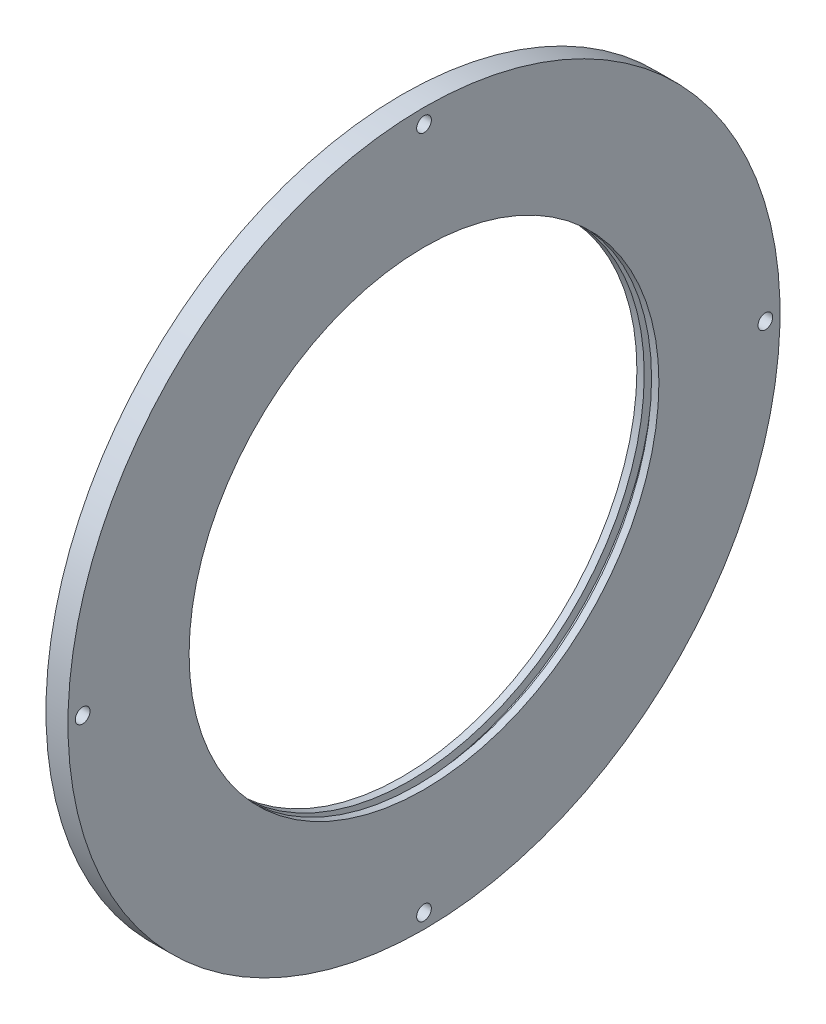
ISO-10303-21;
HEADER;
FILE_DESCRIPTION(('STEP AP214'),'2;1');
FILE_NAME('part.step','',(''),(''),'','','');
FILE_SCHEMA(('AUTOMOTIVE_DESIGN { 1 0 10303 214 1 1 1 1 }'));
ENDSEC;
DATA;
#1=APPLICATION_CONTEXT('core data for automotive mechanical design processes');
#2=APPLICATION_PROTOCOL_DEFINITION('international standard','automotive_design',2000,#1);
#3=PRODUCT_CONTEXT('',#1,'mechanical');
#4=PRODUCT('Part','Part','',(#3));
#5=PRODUCT_RELATED_PRODUCT_CATEGORY('part','',(#4));
#6=PRODUCT_DEFINITION_FORMATION('','',#4);
#7=PRODUCT_DEFINITION_CONTEXT('part definition',#1,'design');
#8=PRODUCT_DEFINITION('design','',#6,#7);
#9=PRODUCT_DEFINITION_SHAPE('','',#8);
#10=(LENGTH_UNIT() NAMED_UNIT(*) SI_UNIT(.MILLI.,.METRE.));
#11=(NAMED_UNIT(*) PLANE_ANGLE_UNIT() SI_UNIT($,.RADIAN.));
#12=(NAMED_UNIT(*) SI_UNIT($,.STERADIAN.) SOLID_ANGLE_UNIT());
#13=UNCERTAINTY_MEASURE_WITH_UNIT(LENGTH_MEASURE(1.E-05),#10,'distance_accuracy_value','');
#14=(GEOMETRIC_REPRESENTATION_CONTEXT(3) GLOBAL_UNCERTAINTY_ASSIGNED_CONTEXT((#13)) GLOBAL_UNIT_ASSIGNED_CONTEXT((#10,
#11,#12)) REPRESENTATION_CONTEXT('',''));
#15=CARTESIAN_POINT('',(0.,0.,0.));
#16=DIRECTION('',(0.,0.,1.));
#17=DIRECTION('',(1.,0.,0.));
#18=AXIS2_PLACEMENT_3D('',#15,#16,#17);
#19=CARTESIAN_POINT('',(3.,0.,0.));
#20=DIRECTION('',(1.,0.,0.));
#21=DIRECTION('',(0.,1.,0.));
#22=AXIS2_PLACEMENT_3D('',#19,#20,#21);
#23=CYLINDRICAL_SURFACE('',#22,97.);
#24=CARTESIAN_POINT('',(6.,0.,0.));
#25=DIRECTION('',(1.,0.,0.));
#26=DIRECTION('',(0.,0.,-1.));
#27=AXIS2_PLACEMENT_3D('',#24,#25,#26);
#28=CIRCLE('',#27,97.);
#29=CARTESIAN_POINT('',(6.,-97.,0.));
#30=VERTEX_POINT('',#29);
#31=EDGE_CURVE('E117',#30,#30,#28,.T.);
#32=ORIENTED_EDGE('',*,*,#31,.F.);
#33=DIRECTION('',(-1.,0.,0.));
#34=VECTOR('',#33,1.);
#35=CARTESIAN_POINT('',(3.,-97.,0.));
#36=LINE('',#35,#34);
#37=CARTESIAN_POINT('',(0.,-97.,0.));
#38=VERTEX_POINT('',#37);
#39=EDGE_CURVE('E11',#30,#38,#36,.T.);
#40=ORIENTED_EDGE('',*,*,#39,.T.);
#41=CARTESIAN_POINT('',(0.,0.,0.));
#42=DIRECTION('',(1.,0.,0.));
#43=DIRECTION('',(0.,0.,-1.));
#44=AXIS2_PLACEMENT_3D('',#41,#42,#43);
#45=CIRCLE('',#44,97.);
#46=EDGE_CURVE('E28',#38,#38,#45,.T.);
#47=ORIENTED_EDGE('',*,*,#46,.T.);
#48=ORIENTED_EDGE('',*,*,#39,.F.);
#49=EDGE_LOOP('',(#32,#40,#47,#48));
#50=FACE_BOUND('',#49,.T.);
#51=ADVANCED_FACE('F17',(#50),#23,.T.);
#52=CARTESIAN_POINT('',(0.,97.,0.));
#53=DIRECTION('',(-1.,0.,0.));
#54=DIRECTION('',(0.,0.,1.));
#55=AXIS2_PLACEMENT_3D('',#52,#53,#54);
#56=PLANE('',#55);
#57=CARTESIAN_POINT('',(0.,0.,0.));
#58=DIRECTION('',(1.,0.,0.));
#59=DIRECTION('',(0.,0.,-1.));
#60=AXIS2_PLACEMENT_3D('',#57,#58,#59);
#61=CIRCLE('',#60,64.);
#62=CARTESIAN_POINT('',(0.,-64.,0.));
#63=VERTEX_POINT('',#62);
#64=EDGE_CURVE('E110',#63,#63,#61,.T.);
#65=ORIENTED_EDGE('',*,*,#64,.T.);
#66=EDGE_LOOP('',(#65));
#67=FACE_BOUND('',#66,.T.);
#68=CARTESIAN_POINT('',(0.,0.,93.));
#69=DIRECTION('',(1.,0.,0.));
#70=DIRECTION('',(0.,0.,-1.));
#71=AXIS2_PLACEMENT_3D('',#68,#69,#70);
#72=CIRCLE('',#71,2.);
#73=CARTESIAN_POINT('',(0.,0.,95.));
#74=VERTEX_POINT('',#73);
#75=EDGE_CURVE('E121',#74,#74,#72,.T.);
#76=ORIENTED_EDGE('',*,*,#75,.T.);
#77=EDGE_LOOP('',(#76));
#78=FACE_BOUND('',#77,.T.);
#79=CARTESIAN_POINT('',(0.,-93.,0.));
#80=DIRECTION('',(1.,0.,0.));
#81=DIRECTION('',(0.,0.,-1.));
#82=AXIS2_PLACEMENT_3D('',#79,#80,#81);
#83=CIRCLE('',#82,2.);
#84=CARTESIAN_POINT('',(0.,-93.,2.));
#85=VERTEX_POINT('',#84);
#86=EDGE_CURVE('E116',#85,#85,#83,.T.);
#87=ORIENTED_EDGE('',*,*,#86,.T.);
#88=EDGE_LOOP('',(#87));
#89=FACE_BOUND('',#88,.T.);
#90=CARTESIAN_POINT('',(0.,93.,0.));
#91=DIRECTION('',(1.,0.,0.));
#92=DIRECTION('',(0.,0.,-1.));
#93=AXIS2_PLACEMENT_3D('',#90,#91,#92);
#94=CIRCLE('',#93,2.);
#95=CARTESIAN_POINT('',(0.,93.,2.));
#96=VERTEX_POINT('',#95);
#97=EDGE_CURVE('E140',#96,#96,#94,.T.);
#98=ORIENTED_EDGE('',*,*,#97,.T.);
#99=EDGE_LOOP('',(#98));
#100=FACE_BOUND('',#99,.T.);
#101=CARTESIAN_POINT('',(0.,0.,-93.));
#102=DIRECTION('',(1.,0.,0.));
#103=DIRECTION('',(0.,0.,-1.));
#104=AXIS2_PLACEMENT_3D('',#101,#102,#103);
#105=CIRCLE('',#104,2.);
#106=CARTESIAN_POINT('',(0.,0.,-91.));
#107=VERTEX_POINT('',#106);
#108=EDGE_CURVE('E131',#107,#107,#105,.T.);
#109=ORIENTED_EDGE('',*,*,#108,.T.);
#110=EDGE_LOOP('',(#109));
#111=FACE_BOUND('',#110,.T.);
#112=ORIENTED_EDGE('',*,*,#46,.F.);
#113=EDGE_LOOP('',(#112));
#114=FACE_BOUND('',#113,.T.);
#115=ADVANCED_FACE('F186',(#67,#78,#89,#100,#111,#114),#56,.T.);
#116=CARTESIAN_POINT('',(1.,0.,0.));
#117=DIRECTION('',(1.,0.,0.));
#118=DIRECTION('',(0.,1.,0.));
#119=AXIS2_PLACEMENT_3D('',#116,#117,#118);
#120=CYLINDRICAL_SURFACE('',#119,64.);
#121=CARTESIAN_POINT('',(2.,0.,0.));
#122=DIRECTION('',(1.,0.,0.));
#123=DIRECTION('',(0.,0.,-1.));
#124=AXIS2_PLACEMENT_3D('',#121,#122,#123);
#125=CIRCLE('',#124,64.);
#126=CARTESIAN_POINT('',(2.,-64.,0.));
#127=VERTEX_POINT('',#126);
#128=EDGE_CURVE('E126',#127,#127,#125,.T.);
#129=ORIENTED_EDGE('',*,*,#128,.T.);
#130=DIRECTION('',(-1.,0.,0.));
#131=VECTOR('',#130,1.);
#132=CARTESIAN_POINT('',(1.,-64.,0.));
#133=LINE('',#132,#131);
#134=EDGE_CURVE('E127',#127,#63,#133,.T.);
#135=ORIENTED_EDGE('',*,*,#134,.T.);
#136=ORIENTED_EDGE('',*,*,#64,.F.);
#137=ORIENTED_EDGE('',*,*,#134,.F.);
#138=EDGE_LOOP('',(#129,#135,#136,#137));
#139=FACE_BOUND('',#138,.T.);
#140=ADVANCED_FACE('F212',(#139),#120,.F.);
#141=CARTESIAN_POINT('',(2.,64.,0.));
#142=DIRECTION('',(1.,0.,0.));
#143=DIRECTION('',(0.,1.,0.));
#144=AXIS2_PLACEMENT_3D('',#141,#142,#143);
#145=PLANE('',#144);
#146=ORIENTED_EDGE('',*,*,#128,.F.);
#147=EDGE_LOOP('',(#146));
#148=FACE_BOUND('',#147,.T.);
#149=CARTESIAN_POINT('',(2.,0.,0.));
#150=DIRECTION('',(1.,0.,0.));
#151=DIRECTION('',(0.,0.,-1.));
#152=AXIS2_PLACEMENT_3D('',#149,#150,#151);
#153=CIRCLE('',#152,66.2575761285906);
#154=CARTESIAN_POINT('',(2.,-66.2575761285906,0.));
#155=VERTEX_POINT('',#154);
#156=EDGE_CURVE('E122',#155,#155,#153,.T.);
#157=ORIENTED_EDGE('',*,*,#156,.T.);
#158=EDGE_LOOP('',(#157));
#159=FACE_BOUND('',#158,.T.);
#160=ADVANCED_FACE('F218',(#148,#159),#145,.T.);
#161=CARTESIAN_POINT('',(3.,0.,0.));
#162=DIRECTION('',(1.,0.,0.));
#163=DIRECTION('',(0.,1.,0.));
#164=AXIS2_PLACEMENT_3D('',#161,#162,#163);
#165=CYLINDRICAL_SURFACE('',#164,66.2575761285906);
#166=CARTESIAN_POINT('',(4.,0.,0.));
#167=DIRECTION('',(1.,0.,0.));
#168=DIRECTION('',(0.,0.,-1.));
#169=AXIS2_PLACEMENT_3D('',#166,#167,#168);
#170=CIRCLE('',#169,66.2575761285906);
#171=CARTESIAN_POINT('',(4.,-66.2575761285906,0.));
#172=VERTEX_POINT('',#171);
#173=EDGE_CURVE('E21',#172,#172,#170,.T.);
#174=ORIENTED_EDGE('',*,*,#173,.T.);
#175=DIRECTION('',(-1.,0.,0.));
#176=VECTOR('',#175,1.);
#177=CARTESIAN_POINT('',(3.,-66.2575761285906,0.));
#178=LINE('',#177,#176);
#179=EDGE_CURVE('E101',#172,#155,#178,.T.);
#180=ORIENTED_EDGE('',*,*,#179,.T.);
#181=ORIENTED_EDGE('',*,*,#156,.F.);
#182=ORIENTED_EDGE('',*,*,#179,.F.);
#183=EDGE_LOOP('',(#174,#180,#181,#182));
#184=FACE_BOUND('',#183,.T.);
#185=ADVANCED_FACE('F222',(#184),#165,.F.);
#186=CARTESIAN_POINT('',(4.,66.2575761285906,0.));
#187=DIRECTION('',(-1.,0.,0.));
#188=DIRECTION('',(0.,0.,1.));
#189=AXIS2_PLACEMENT_3D('',#186,#187,#188);
#190=PLANE('',#189);
#191=CARTESIAN_POINT('',(4.,0.,0.));
#192=DIRECTION('',(1.,0.,0.));
#193=DIRECTION('',(0.,0.,-1.));
#194=AXIS2_PLACEMENT_3D('',#191,#192,#193);
#195=CIRCLE('',#194,64.);
#196=CARTESIAN_POINT('',(4.,-64.,0.));
#197=VERTEX_POINT('',#196);
#198=EDGE_CURVE('E87',#197,#197,#195,.T.);
#199=ORIENTED_EDGE('',*,*,#198,.T.);
#200=EDGE_LOOP('',(#199));
#201=FACE_BOUND('',#200,.T.);
#202=ORIENTED_EDGE('',*,*,#173,.F.);
#203=EDGE_LOOP('',(#202));
#204=FACE_BOUND('',#203,.T.);
#205=ADVANCED_FACE('F88',(#201,#204),#190,.T.);
#206=CARTESIAN_POINT('',(5.,0.,0.));
#207=DIRECTION('',(1.,0.,0.));
#208=DIRECTION('',(0.,1.,0.));
#209=AXIS2_PLACEMENT_3D('',#206,#207,#208);
#210=CYLINDRICAL_SURFACE('',#209,64.);
#211=CARTESIAN_POINT('',(6.,0.,0.));
#212=DIRECTION('',(1.,0.,0.));
#213=DIRECTION('',(0.,0.,-1.));
#214=AXIS2_PLACEMENT_3D('',#211,#212,#213);
#215=CIRCLE('',#214,64.);
#216=CARTESIAN_POINT('',(6.,-64.,0.));
#217=VERTEX_POINT('',#216);
#218=EDGE_CURVE('E102',#217,#217,#215,.T.);
#219=ORIENTED_EDGE('',*,*,#218,.T.);
#220=DIRECTION('',(-1.,0.,0.));
#221=VECTOR('',#220,1.);
#222=CARTESIAN_POINT('',(5.,-64.,0.));
#223=LINE('',#222,#221);
#224=EDGE_CURVE('E93',#217,#197,#223,.T.);
#225=ORIENTED_EDGE('',*,*,#224,.T.);
#226=ORIENTED_EDGE('',*,*,#198,.F.);
#227=ORIENTED_EDGE('',*,*,#224,.F.);
#228=EDGE_LOOP('',(#219,#225,#226,#227));
#229=FACE_BOUND('',#228,.T.);
#230=ADVANCED_FACE('F194',(#229),#210,.F.);
#231=CARTESIAN_POINT('',(6.,64.,0.));
#232=DIRECTION('',(1.,0.,0.));
#233=DIRECTION('',(0.,1.,0.));
#234=AXIS2_PLACEMENT_3D('',#231,#232,#233);
#235=PLANE('',#234);
#236=ORIENTED_EDGE('',*,*,#218,.F.);
#237=EDGE_LOOP('',(#236));
#238=FACE_BOUND('',#237,.T.);
#239=CARTESIAN_POINT('',(6.,0.,93.));
#240=DIRECTION('',(-1.,0.,0.));
#241=DIRECTION('',(0.,0.,-1.));
#242=AXIS2_PLACEMENT_3D('',#239,#240,#241);
#243=CIRCLE('',#242,2.);
#244=CARTESIAN_POINT('',(6.,0.,95.));
#245=VERTEX_POINT('',#244);
#246=EDGE_CURVE('E111',#245,#245,#243,.T.);
#247=ORIENTED_EDGE('',*,*,#246,.T.);
#248=EDGE_LOOP('',(#247));
#249=FACE_BOUND('',#248,.T.);
#250=CARTESIAN_POINT('',(6.,-93.,0.));
#251=DIRECTION('',(-1.,0.,0.));
#252=DIRECTION('',(0.,0.,-1.));
#253=AXIS2_PLACEMENT_3D('',#250,#251,#252);
#254=CIRCLE('',#253,2.);
#255=CARTESIAN_POINT('',(6.,-93.,2.));
#256=VERTEX_POINT('',#255);
#257=EDGE_CURVE('E144',#256,#256,#254,.T.);
#258=ORIENTED_EDGE('',*,*,#257,.T.);
#259=EDGE_LOOP('',(#258));
#260=FACE_BOUND('',#259,.T.);
#261=CARTESIAN_POINT('',(6.,93.,0.));
#262=DIRECTION('',(-1.,0.,0.));
#263=DIRECTION('',(0.,0.,-1.));
#264=AXIS2_PLACEMENT_3D('',#261,#262,#263);
#265=CIRCLE('',#264,2.);
#266=CARTESIAN_POINT('',(6.,93.,2.));
#267=VERTEX_POINT('',#266);
#268=EDGE_CURVE('E134',#267,#267,#265,.T.);
#269=ORIENTED_EDGE('',*,*,#268,.T.);
#270=EDGE_LOOP('',(#269));
#271=FACE_BOUND('',#270,.T.);
#272=CARTESIAN_POINT('',(6.,0.,-93.));
#273=DIRECTION('',(-1.,0.,0.));
#274=DIRECTION('',(0.,0.,-1.));
#275=AXIS2_PLACEMENT_3D('',#272,#273,#274);
#276=CIRCLE('',#275,2.);
#277=CARTESIAN_POINT('',(6.,0.,-91.));
#278=VERTEX_POINT('',#277);
#279=EDGE_CURVE('E106',#278,#278,#276,.T.);
#280=ORIENTED_EDGE('',*,*,#279,.T.);
#281=EDGE_LOOP('',(#280));
#282=FACE_BOUND('',#281,.T.);
#283=ORIENTED_EDGE('',*,*,#31,.T.);
#284=EDGE_LOOP('',(#283));
#285=FACE_BOUND('',#284,.T.);
#286=ADVANCED_FACE('F19',(#238,#249,#260,#271,#282,#285),#235,.T.);
#287=CARTESIAN_POINT('',(6.,0.,93.));
#288=DIRECTION('',(-1.,0.,0.));
#289=DIRECTION('',(0.,0.,-1.));
#290=AXIS2_PLACEMENT_3D('',#287,#288,#289);
#291=CYLINDRICAL_SURFACE('',#290,2.);
#292=ORIENTED_EDGE('',*,*,#246,.F.);
#293=DIRECTION('',(-1.,0.,0.));
#294=VECTOR('',#293,1.);
#295=CARTESIAN_POINT('',(6.,0.,95.));
#296=LINE('',#295,#294);
#297=EDGE_CURVE('E115',#245,#74,#296,.T.);
#298=ORIENTED_EDGE('',*,*,#297,.T.);
#299=ORIENTED_EDGE('',*,*,#75,.F.);
#300=ORIENTED_EDGE('',*,*,#297,.F.);
#301=EDGE_LOOP('',(#292,#298,#299,#300));
#302=FACE_BOUND('',#301,.T.);
#303=ADVANCED_FACE('F193',(#302),#291,.F.);
#304=CARTESIAN_POINT('',(6.,-93.,0.));
#305=DIRECTION('',(-1.,0.,0.));
#306=DIRECTION('',(0.,0.,-1.));
#307=AXIS2_PLACEMENT_3D('',#304,#305,#306);
#308=CYLINDRICAL_SURFACE('',#307,2.);
#309=ORIENTED_EDGE('',*,*,#257,.F.);
#310=DIRECTION('',(-1.,0.,0.));
#311=VECTOR('',#310,1.);
#312=CARTESIAN_POINT('',(6.,-93.,2.));
#313=LINE('',#312,#311);
#314=EDGE_CURVE('E148',#256,#85,#313,.T.);
#315=ORIENTED_EDGE('',*,*,#314,.T.);
#316=ORIENTED_EDGE('',*,*,#86,.F.);
#317=ORIENTED_EDGE('',*,*,#314,.F.);
#318=EDGE_LOOP('',(#309,#315,#316,#317));
#319=FACE_BOUND('',#318,.T.);
#320=ADVANCED_FACE('F190',(#319),#308,.F.);
#321=CARTESIAN_POINT('',(6.,93.,0.));
#322=DIRECTION('',(-1.,0.,0.));
#323=DIRECTION('',(0.,0.,-1.));
#324=AXIS2_PLACEMENT_3D('',#321,#322,#323);
#325=CYLINDRICAL_SURFACE('',#324,2.);
#326=ORIENTED_EDGE('',*,*,#268,.F.);
#327=DIRECTION('',(-1.,0.,0.));
#328=VECTOR('',#327,1.);
#329=CARTESIAN_POINT('',(6.,93.,2.));
#330=LINE('',#329,#328);
#331=EDGE_CURVE('E136',#267,#96,#330,.T.);
#332=ORIENTED_EDGE('',*,*,#331,.T.);
#333=ORIENTED_EDGE('',*,*,#97,.F.);
#334=ORIENTED_EDGE('',*,*,#331,.F.);
#335=EDGE_LOOP('',(#326,#332,#333,#334));
#336=FACE_BOUND('',#335,.T.);
#337=ADVANCED_FACE('F173',(#336),#325,.F.);
#338=CARTESIAN_POINT('',(6.,0.,-93.));
#339=DIRECTION('',(-1.,0.,0.));
#340=DIRECTION('',(0.,0.,-1.));
#341=AXIS2_PLACEMENT_3D('',#338,#339,#340);
#342=CYLINDRICAL_SURFACE('',#341,2.);
#343=ORIENTED_EDGE('',*,*,#279,.F.);
#344=DIRECTION('',(-1.,0.,0.));
#345=VECTOR('',#344,1.);
#346=CARTESIAN_POINT('',(6.,0.,-91.));
#347=LINE('',#346,#345);
#348=EDGE_CURVE('E135',#278,#107,#347,.T.);
#349=ORIENTED_EDGE('',*,*,#348,.T.);
#350=ORIENTED_EDGE('',*,*,#108,.F.);
#351=ORIENTED_EDGE('',*,*,#348,.F.);
#352=EDGE_LOOP('',(#343,#349,#350,#351));
#353=FACE_BOUND('',#352,.T.);
#354=ADVANCED_FACE('F226',(#353),#342,.F.);
#355=CLOSED_SHELL('',(#51,#115,#140,#160,#185,#205,#230,#286,#303,#320,#337,#354));
#356=MANIFOLD_SOLID_BREP('B1',#355);
#357=ADVANCED_BREP_SHAPE_REPRESENTATION('',(#18,#356),#14);
#358=SHAPE_DEFINITION_REPRESENTATION(#9,#357);
ENDSEC;
END-ISO-10303-21;
